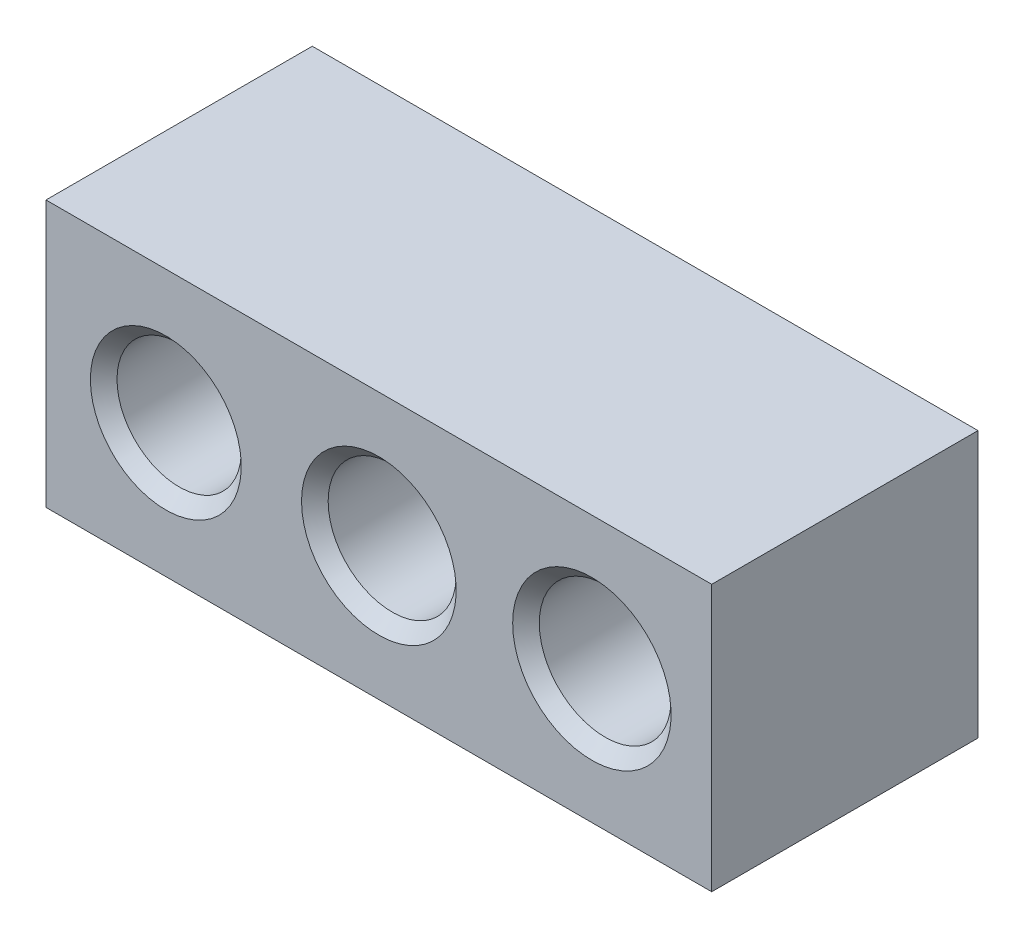
ISO-10303-21;
HEADER;
FILE_DESCRIPTION(('STEP AP214'),'2;1');
FILE_NAME('part.step','',(''),(''),'','','');
FILE_SCHEMA(('AUTOMOTIVE_DESIGN { 1 0 10303 214 1 1 1 1 }'));
ENDSEC;
DATA;
#1=APPLICATION_CONTEXT('core data for automotive mechanical design processes');
#2=APPLICATION_PROTOCOL_DEFINITION('international standard','automotive_design',2000,#1);
#3=PRODUCT_CONTEXT('',#1,'mechanical');
#4=PRODUCT('Part','Part','',(#3));
#5=PRODUCT_RELATED_PRODUCT_CATEGORY('part','',(#4));
#6=PRODUCT_DEFINITION_FORMATION('','',#4);
#7=PRODUCT_DEFINITION_CONTEXT('part definition',#1,'design');
#8=PRODUCT_DEFINITION('design','',#6,#7);
#9=PRODUCT_DEFINITION_SHAPE('','',#8);
#10=(LENGTH_UNIT() NAMED_UNIT(*) SI_UNIT(.MILLI.,.METRE.));
#11=(NAMED_UNIT(*) PLANE_ANGLE_UNIT() SI_UNIT($,.RADIAN.));
#12=(NAMED_UNIT(*) SI_UNIT($,.STERADIAN.) SOLID_ANGLE_UNIT());
#13=UNCERTAINTY_MEASURE_WITH_UNIT(LENGTH_MEASURE(1.E-05),#10,'distance_accuracy_value','');
#14=(GEOMETRIC_REPRESENTATION_CONTEXT(3) GLOBAL_UNCERTAINTY_ASSIGNED_CONTEXT((#13)) GLOBAL_UNIT_ASSIGNED_CONTEXT((#10,
#11,#12)) REPRESENTATION_CONTEXT('',''));
#15=CARTESIAN_POINT('',(0.,0.,0.));
#16=DIRECTION('',(0.,0.,1.));
#17=DIRECTION('',(1.,0.,0.));
#18=AXIS2_PLACEMENT_3D('',#15,#16,#17);
#19=CARTESIAN_POINT('',(0.,0.,10.));
#20=DIRECTION('',(0.,0.,-1.));
#21=DIRECTION('',(-1.,0.,0.));
#22=AXIS2_PLACEMENT_3D('',#19,#20,#21);
#23=PLANE('',#22);
#24=CARTESIAN_POINT('',(8.,0.,10.));
#25=DIRECTION('',(0.,0.,-1.));
#26=DIRECTION('',(-1.,0.,0.));
#27=AXIS2_PLACEMENT_3D('',#24,#25,#26);
#28=CIRCLE('',#27,2.97487373415292);
#29=CARTESIAN_POINT('',(5.02512626584708,0.,10.));
#30=VERTEX_POINT('',#29);
#31=EDGE_CURVE('E122',#30,#30,#28,.T.);
#32=ORIENTED_EDGE('',*,*,#31,.T.);
#33=EDGE_LOOP('',(#32));
#34=FACE_BOUND('',#33,.T.);
#35=CARTESIAN_POINT('',(0.,0.,10.));
#36=DIRECTION('',(0.,0.,-1.));
#37=DIRECTION('',(-1.,0.,0.));
#38=AXIS2_PLACEMENT_3D('',#35,#36,#37);
#39=CIRCLE('',#38,2.90416305603427);
#40=CARTESIAN_POINT('',(-2.90416305603427,0.,10.));
#41=VERTEX_POINT('',#40);
#42=EDGE_CURVE('E119',#41,#41,#39,.T.);
#43=ORIENTED_EDGE('',*,*,#42,.T.);
#44=EDGE_LOOP('',(#43));
#45=FACE_BOUND('',#44,.T.);
#46=CARTESIAN_POINT('',(-8.,0.,10.));
#47=DIRECTION('',(0.,0.,-1.));
#48=DIRECTION('',(-1.,0.,0.));
#49=AXIS2_PLACEMENT_3D('',#46,#47,#48);
#50=CIRCLE('',#49,2.83345237791561);
#51=CARTESIAN_POINT('',(-10.8334523779156,0.,10.));
#52=VERTEX_POINT('',#51);
#53=EDGE_CURVE('E116',#52,#52,#50,.T.);
#54=ORIENTED_EDGE('',*,*,#53,.T.);
#55=EDGE_LOOP('',(#54));
#56=FACE_BOUND('',#55,.T.);
#57=DIRECTION('',(0.,1.,0.));
#58=VECTOR('',#57,1.);
#59=CARTESIAN_POINT('',(12.5,-5.,10.));
#60=LINE('',#59,#58);
#61=CARTESIAN_POINT('',(12.5,-5.,10.));
#62=VERTEX_POINT('',#61);
#63=CARTESIAN_POINT('',(12.5,5.,10.));
#64=VERTEX_POINT('',#63);
#65=EDGE_CURVE('E88',#62,#64,#60,.T.);
#66=ORIENTED_EDGE('',*,*,#65,.T.);
#67=DIRECTION('',(-1.,0.,0.));
#68=VECTOR('',#67,1.);
#69=CARTESIAN_POINT('',(-12.5,5.,10.));
#70=LINE('',#69,#68);
#71=CARTESIAN_POINT('',(-12.5,5.,10.));
#72=VERTEX_POINT('',#71);
#73=EDGE_CURVE('E84',#64,#72,#70,.T.);
#74=ORIENTED_EDGE('',*,*,#73,.T.);
#75=DIRECTION('',(0.,-1.,0.));
#76=VECTOR('',#75,1.);
#77=CARTESIAN_POINT('',(-12.5,-5.,10.));
#78=LINE('',#77,#76);
#79=CARTESIAN_POINT('',(-12.5,-5.,10.));
#80=VERTEX_POINT('',#79);
#81=EDGE_CURVE('E86',#72,#80,#78,.T.);
#82=ORIENTED_EDGE('',*,*,#81,.T.);
#83=DIRECTION('',(1.,0.,0.));
#84=VECTOR('',#83,1.);
#85=CARTESIAN_POINT('',(-12.5,-5.,10.));
#86=LINE('',#85,#84);
#87=EDGE_CURVE('E53',#80,#62,#86,.T.);
#88=ORIENTED_EDGE('',*,*,#87,.T.);
#89=EDGE_LOOP('',(#66,#74,#82,#88));
#90=FACE_BOUND('',#89,.T.);
#91=ADVANCED_FACE('F35',(#34,#45,#56,#90),#23,.F.);
#92=CARTESIAN_POINT('',(0.,0.,0.));
#93=DIRECTION('',(0.,0.,-1.));
#94=DIRECTION('',(-1.,0.,0.));
#95=AXIS2_PLACEMENT_3D('',#92,#93,#94);
#96=PLANE('',#95);
#97=CARTESIAN_POINT('',(8.,0.,0.));
#98=DIRECTION('',(0.,0.,1.));
#99=DIRECTION('',(1.,0.,0.));
#100=AXIS2_PLACEMENT_3D('',#97,#98,#99);
#101=CIRCLE('',#100,2.47487373415292);
#102=CARTESIAN_POINT('',(10.4748737341529,0.,0.));
#103=VERTEX_POINT('',#102);
#104=EDGE_CURVE('E186',#103,#103,#101,.T.);
#105=ORIENTED_EDGE('',*,*,#104,.T.);
#106=EDGE_LOOP('',(#105));
#107=FACE_BOUND('',#106,.T.);
#108=DIRECTION('',(0.,1.,0.));
#109=VECTOR('',#108,1.);
#110=CARTESIAN_POINT('',(12.5,-5.,0.));
#111=LINE('',#110,#109);
#112=CARTESIAN_POINT('',(12.5,-5.,0.));
#113=VERTEX_POINT('',#112);
#114=CARTESIAN_POINT('',(12.5,5.,0.));
#115=VERTEX_POINT('',#114);
#116=EDGE_CURVE('E103',#113,#115,#111,.T.);
#117=ORIENTED_EDGE('',*,*,#116,.F.);
#118=DIRECTION('',(1.,0.,0.));
#119=VECTOR('',#118,1.);
#120=CARTESIAN_POINT('',(-12.5,-5.,0.));
#121=LINE('',#120,#119);
#122=CARTESIAN_POINT('',(-12.5,-5.,0.));
#123=VERTEX_POINT('',#122);
#124=EDGE_CURVE('E76',#123,#113,#121,.T.);
#125=ORIENTED_EDGE('',*,*,#124,.F.);
#126=DIRECTION('',(0.,-1.,0.));
#127=VECTOR('',#126,1.);
#128=CARTESIAN_POINT('',(-12.5,-5.,0.));
#129=LINE('',#128,#127);
#130=CARTESIAN_POINT('',(-12.5,5.,0.));
#131=VERTEX_POINT('',#130);
#132=EDGE_CURVE('E70',#131,#123,#129,.T.);
#133=ORIENTED_EDGE('',*,*,#132,.F.);
#134=DIRECTION('',(-1.,0.,0.));
#135=VECTOR('',#134,1.);
#136=CARTESIAN_POINT('',(-12.5,5.,0.));
#137=LINE('',#136,#135);
#138=EDGE_CURVE('E93',#115,#131,#137,.T.);
#139=ORIENTED_EDGE('',*,*,#138,.F.);
#140=EDGE_LOOP('',(#117,#125,#133,#139));
#141=FACE_BOUND('',#140,.T.);
#142=CARTESIAN_POINT('',(0.,0.,0.));
#143=DIRECTION('',(0.,0.,1.));
#144=DIRECTION('',(1.,0.,0.));
#145=AXIS2_PLACEMENT_3D('',#142,#143,#144);
#146=CIRCLE('',#145,2.40416305603426);
#147=CARTESIAN_POINT('',(2.40416305603426,0.,0.));
#148=VERTEX_POINT('',#147);
#149=EDGE_CURVE('E106',#148,#148,#146,.T.);
#150=ORIENTED_EDGE('',*,*,#149,.T.);
#151=EDGE_LOOP('',(#150));
#152=FACE_BOUND('',#151,.T.);
#153=CARTESIAN_POINT('',(-8.,0.,0.));
#154=DIRECTION('',(0.,0.,1.));
#155=DIRECTION('',(1.,0.,0.));
#156=AXIS2_PLACEMENT_3D('',#153,#154,#155);
#157=CIRCLE('',#156,2.33345237791561);
#158=CARTESIAN_POINT('',(-5.66654762208439,0.,0.));
#159=VERTEX_POINT('',#158);
#160=EDGE_CURVE('E184',#159,#159,#157,.T.);
#161=ORIENTED_EDGE('',*,*,#160,.T.);
#162=EDGE_LOOP('',(#161));
#163=FACE_BOUND('',#162,.T.);
#164=ADVANCED_FACE('F145',(#107,#141,#152,#163),#96,.T.);
#165=CARTESIAN_POINT('',(12.5,-5.,10.));
#166=DIRECTION('',(-1.,0.,0.));
#167=DIRECTION('',(0.,0.,1.));
#168=AXIS2_PLACEMENT_3D('',#165,#166,#167);
#169=PLANE('',#168);
#170=ORIENTED_EDGE('',*,*,#116,.T.);
#171=DIRECTION('',(0.,0.,-1.));
#172=VECTOR('',#171,1.);
#173=CARTESIAN_POINT('',(12.5,5.,10.));
#174=LINE('',#173,#172);
#175=EDGE_CURVE('E94',#64,#115,#174,.T.);
#176=ORIENTED_EDGE('',*,*,#175,.F.);
#177=ORIENTED_EDGE('',*,*,#65,.F.);
#178=DIRECTION('',(0.,0.,-1.));
#179=VECTOR('',#178,1.);
#180=CARTESIAN_POINT('',(12.5,-5.,10.));
#181=LINE('',#180,#179);
#182=EDGE_CURVE('E99',#62,#113,#181,.T.);
#183=ORIENTED_EDGE('',*,*,#182,.T.);
#184=EDGE_LOOP('',(#170,#176,#177,#183));
#185=FACE_BOUND('',#184,.T.);
#186=ADVANCED_FACE('F151',(#185),#169,.F.);
#187=CARTESIAN_POINT('',(-12.5,5.,10.));
#188=DIRECTION('',(0.,-1.,0.));
#189=DIRECTION('',(0.,0.,-1.));
#190=AXIS2_PLACEMENT_3D('',#187,#188,#189);
#191=PLANE('',#190);
#192=ORIENTED_EDGE('',*,*,#138,.T.);
#193=DIRECTION('',(0.,0.,-1.));
#194=VECTOR('',#193,1.);
#195=CARTESIAN_POINT('',(-12.5,5.,10.));
#196=LINE('',#195,#194);
#197=EDGE_CURVE('E91',#72,#131,#196,.T.);
#198=ORIENTED_EDGE('',*,*,#197,.F.);
#199=ORIENTED_EDGE('',*,*,#73,.F.);
#200=ORIENTED_EDGE('',*,*,#175,.T.);
#201=EDGE_LOOP('',(#192,#198,#199,#200));
#202=FACE_BOUND('',#201,.T.);
#203=ADVANCED_FACE('F92',(#202),#191,.F.);
#204=CARTESIAN_POINT('',(-12.5,-5.,10.));
#205=DIRECTION('',(1.,0.,0.));
#206=DIRECTION('',(0.,0.,-1.));
#207=AXIS2_PLACEMENT_3D('',#204,#205,#206);
#208=PLANE('',#207);
#209=ORIENTED_EDGE('',*,*,#132,.T.);
#210=DIRECTION('',(0.,0.,-1.));
#211=VECTOR('',#210,1.);
#212=CARTESIAN_POINT('',(-12.5,-5.,10.));
#213=LINE('',#212,#211);
#214=EDGE_CURVE('E95',#80,#123,#213,.T.);
#215=ORIENTED_EDGE('',*,*,#214,.F.);
#216=ORIENTED_EDGE('',*,*,#81,.F.);
#217=ORIENTED_EDGE('',*,*,#197,.T.);
#218=EDGE_LOOP('',(#209,#215,#216,#217));
#219=FACE_BOUND('',#218,.T.);
#220=ADVANCED_FACE('F97',(#219),#208,.F.);
#221=CARTESIAN_POINT('',(-12.5,-5.,10.));
#222=DIRECTION('',(0.,1.,0.));
#223=DIRECTION('',(0.,0.,1.));
#224=AXIS2_PLACEMENT_3D('',#221,#222,#223);
#225=PLANE('',#224);
#226=ORIENTED_EDGE('',*,*,#124,.T.);
#227=ORIENTED_EDGE('',*,*,#182,.F.);
#228=ORIENTED_EDGE('',*,*,#87,.F.);
#229=ORIENTED_EDGE('',*,*,#214,.T.);
#230=EDGE_LOOP('',(#226,#227,#228,#229));
#231=FACE_BOUND('',#230,.T.);
#232=ADVANCED_FACE('F158',(#231),#225,.F.);
#233=CARTESIAN_POINT('',(0.,0.,10.));
#234=DIRECTION('',(0.,0.,-1.));
#235=DIRECTION('',(-1.,0.,0.));
#236=AXIS2_PLACEMENT_3D('',#233,#234,#235);
#237=CYLINDRICAL_SURFACE('',#236,2.40416305603426);
#238=CARTESIAN_POINT('',(0.,0.,9.5));
#239=DIRECTION('',(0.,0.,-1.));
#240=DIRECTION('',(-1.,0.,0.));
#241=AXIS2_PLACEMENT_3D('',#238,#239,#240);
#242=CIRCLE('',#241,2.40416305603426);
#243=CARTESIAN_POINT('',(-2.40416305603426,0.,9.5));
#244=VERTEX_POINT('',#243);
#245=EDGE_CURVE('E45',#244,#244,#242,.F.);
#246=ORIENTED_EDGE('',*,*,#245,.T.);
#247=EDGE_LOOP('',(#246));
#248=FACE_BOUND('',#247,.T.);
#249=ORIENTED_EDGE('',*,*,#149,.F.);
#250=EDGE_LOOP('',(#249));
#251=FACE_BOUND('',#250,.T.);
#252=ADVANCED_FACE('F127',(#248,#251),#237,.F.);
#253=CARTESIAN_POINT('',(8.,0.,10.));
#254=DIRECTION('',(0.,0.,-1.));
#255=DIRECTION('',(-1.,0.,0.));
#256=AXIS2_PLACEMENT_3D('',#253,#254,#255);
#257=CYLINDRICAL_SURFACE('',#256,2.47487373415292);
#258=CARTESIAN_POINT('',(8.,0.,9.5));
#259=DIRECTION('',(0.,0.,-1.));
#260=DIRECTION('',(-1.,0.,0.));
#261=AXIS2_PLACEMENT_3D('',#258,#259,#260);
#262=CIRCLE('',#261,2.47487373415292);
#263=CARTESIAN_POINT('',(5.52512626584708,0.,9.5));
#264=VERTEX_POINT('',#263);
#265=EDGE_CURVE('E113',#264,#264,#262,.F.);
#266=ORIENTED_EDGE('',*,*,#265,.T.);
#267=EDGE_LOOP('',(#266));
#268=FACE_BOUND('',#267,.T.);
#269=ORIENTED_EDGE('',*,*,#104,.F.);
#270=EDGE_LOOP('',(#269));
#271=FACE_BOUND('',#270,.T.);
#272=ADVANCED_FACE('F193',(#268,#271),#257,.F.);
#273=CARTESIAN_POINT('',(-8.,0.,10.));
#274=DIRECTION('',(0.,0.,-1.));
#275=DIRECTION('',(-1.,0.,0.));
#276=AXIS2_PLACEMENT_3D('',#273,#274,#275);
#277=CYLINDRICAL_SURFACE('',#276,2.33345237791561);
#278=CARTESIAN_POINT('',(-8.,0.,9.5));
#279=DIRECTION('',(0.,0.,-1.));
#280=DIRECTION('',(-1.,0.,0.));
#281=AXIS2_PLACEMENT_3D('',#278,#279,#280);
#282=CIRCLE('',#281,2.33345237791561);
#283=CARTESIAN_POINT('',(-10.3334523779156,0.,9.5));
#284=VERTEX_POINT('',#283);
#285=EDGE_CURVE('E11',#284,#284,#282,.F.);
#286=ORIENTED_EDGE('',*,*,#285,.T.);
#287=EDGE_LOOP('',(#286));
#288=FACE_BOUND('',#287,.T.);
#289=ORIENTED_EDGE('',*,*,#160,.F.);
#290=EDGE_LOOP('',(#289));
#291=FACE_BOUND('',#290,.T.);
#292=ADVANCED_FACE('F139',(#288,#291),#277,.F.);
#293=CARTESIAN_POINT('',(8.,0.,9.5));
#294=DIRECTION('',(0.,0.,1.));
#295=DIRECTION('',(1.,0.,0.));
#296=AXIS2_PLACEMENT_3D('',#293,#294,#295);
#297=CONICAL_SURFACE('',#296,2.47487373415292,0.785398163397449);
#298=ORIENTED_EDGE('',*,*,#31,.F.);
#299=EDGE_LOOP('',(#298));
#300=FACE_BOUND('',#299,.T.);
#301=ORIENTED_EDGE('',*,*,#265,.F.);
#302=EDGE_LOOP('',(#301));
#303=FACE_BOUND('',#302,.T.);
#304=ADVANCED_FACE('F132',(#300,#303),#297,.F.);
#305=CARTESIAN_POINT('',(0.,0.,9.5));
#306=DIRECTION('',(0.,0.,1.));
#307=DIRECTION('',(1.,0.,0.));
#308=AXIS2_PLACEMENT_3D('',#305,#306,#307);
#309=CONICAL_SURFACE('',#308,2.40416305603426,0.78539816339745);
#310=ORIENTED_EDGE('',*,*,#42,.F.);
#311=EDGE_LOOP('',(#310));
#312=FACE_BOUND('',#311,.T.);
#313=ORIENTED_EDGE('',*,*,#245,.F.);
#314=EDGE_LOOP('',(#313));
#315=FACE_BOUND('',#314,.T.);
#316=ADVANCED_FACE('F130',(#312,#315),#309,.F.);
#317=CARTESIAN_POINT('',(-8.,0.,9.5));
#318=DIRECTION('',(0.,0.,1.));
#319=DIRECTION('',(1.,0.,0.));
#320=AXIS2_PLACEMENT_3D('',#317,#318,#319);
#321=CONICAL_SURFACE('',#320,2.33345237791561,0.78539816339745);
#322=ORIENTED_EDGE('',*,*,#53,.F.);
#323=EDGE_LOOP('',(#322));
#324=FACE_BOUND('',#323,.T.);
#325=ORIENTED_EDGE('',*,*,#285,.F.);
#326=EDGE_LOOP('',(#325));
#327=FACE_BOUND('',#326,.T.);
#328=ADVANCED_FACE('F38',(#324,#327),#321,.F.);
#329=CLOSED_SHELL('',(#91,#164,#186,#203,#220,#232,#252,#272,#292,#304,#316,#328));
#330=MANIFOLD_SOLID_BREP('B2',#329);
#331=ADVANCED_BREP_SHAPE_REPRESENTATION('',(#18,#330),#14);
#332=SHAPE_DEFINITION_REPRESENTATION(#9,#331);
ENDSEC;
END-ISO-10303-21;
